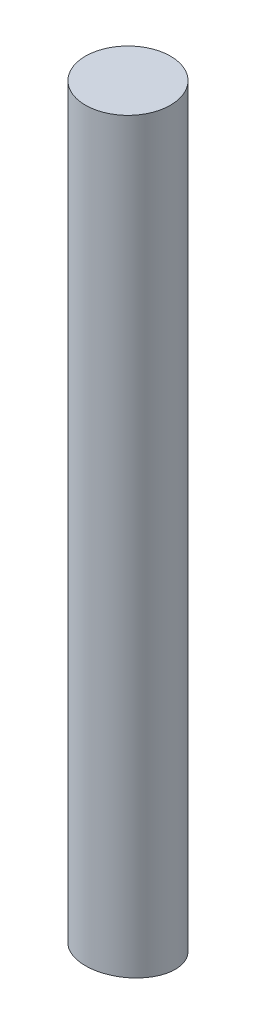
ISO-10303-21;
HEADER;
FILE_DESCRIPTION(('STEP AP214'),'2;1');
FILE_NAME('part.step','',(''),(''),'','','');
FILE_SCHEMA(('AUTOMOTIVE_DESIGN { 1 0 10303 214 1 1 1 1 }'));
ENDSEC;
DATA;
#1=APPLICATION_CONTEXT('core data for automotive mechanical design processes');
#2=APPLICATION_PROTOCOL_DEFINITION('international standard','automotive_design',2000,#1);
#3=PRODUCT_CONTEXT('',#1,'mechanical');
#4=PRODUCT('Part','Part','',(#3));
#5=PRODUCT_RELATED_PRODUCT_CATEGORY('part','',(#4));
#6=PRODUCT_DEFINITION_FORMATION('','',#4);
#7=PRODUCT_DEFINITION_CONTEXT('part definition',#1,'design');
#8=PRODUCT_DEFINITION('design','',#6,#7);
#9=PRODUCT_DEFINITION_SHAPE('','',#8);
#10=(LENGTH_UNIT() NAMED_UNIT(*) SI_UNIT(.MILLI.,.METRE.));
#11=(NAMED_UNIT(*) PLANE_ANGLE_UNIT() SI_UNIT($,.RADIAN.));
#12=(NAMED_UNIT(*) SI_UNIT($,.STERADIAN.) SOLID_ANGLE_UNIT());
#13=UNCERTAINTY_MEASURE_WITH_UNIT(LENGTH_MEASURE(1.E-05),#10,'distance_accuracy_value','');
#14=(GEOMETRIC_REPRESENTATION_CONTEXT(3) GLOBAL_UNCERTAINTY_ASSIGNED_CONTEXT((#13)) GLOBAL_UNIT_ASSIGNED_CONTEXT((#10,
#11,#12)) REPRESENTATION_CONTEXT('',''));
#15=CARTESIAN_POINT('',(0.,0.,0.));
#16=DIRECTION('',(0.,0.,1.));
#17=DIRECTION('',(1.,0.,0.));
#18=AXIS2_PLACEMENT_3D('',#15,#16,#17);
#19=CARTESIAN_POINT('',(-208.,-800.,-27.));
#20=DIRECTION('',(0.,1.,0.));
#21=DIRECTION('',(0.,0.,1.));
#22=AXIS2_PLACEMENT_3D('',#19,#20,#21);
#23=CYLINDRICAL_SURFACE('',#22,45.);
#24=CARTESIAN_POINT('',(-208.,0.,-27.));
#25=DIRECTION('',(0.,-1.,0.));
#26=DIRECTION('',(0.,0.,-1.));
#27=AXIS2_PLACEMENT_3D('',#24,#25,#26);
#28=CIRCLE('',#27,45.);
#29=CARTESIAN_POINT('',(-208.,0.,-71.9999999999999));
#30=VERTEX_POINT('',#29);
#31=EDGE_CURVE('E10',#30,#30,#28,.T.);
#32=ORIENTED_EDGE('',*,*,#31,.T.);
#33=EDGE_LOOP('',(#32));
#34=FACE_BOUND('',#33,.T.);
#35=CARTESIAN_POINT('',(-208.,-794.474694759369,-27.));
#36=DIRECTION('',(0.,-0.992546151641322,0.121869343405148));
#37=DIRECTION('',(0.,0.121869343405148,0.992546151641322));
#38=AXIS2_PLACEMENT_3D('',#35,#36,#37);
#39=ELLIPSE('',#38,45.3379421456481,45.);
#40=CARTESIAN_POINT('',(-208.,-788.949389518739,18.));
#41=VERTEX_POINT('',#40);
#42=EDGE_CURVE('E38',#41,#41,#39,.T.);
#43=ORIENTED_EDGE('',*,*,#42,.F.);
#44=EDGE_LOOP('',(#43));
#45=FACE_BOUND('',#44,.T.);
#46=ADVANCED_FACE('F32',(#34,#45),#23,.T.);
#47=CARTESIAN_POINT('',(-208.,0.,-27.));
#48=DIRECTION('',(0.,-1.,0.));
#49=DIRECTION('',(0.,0.,-1.));
#50=AXIS2_PLACEMENT_3D('',#47,#48,#49);
#51=PLANE('',#50);
#52=ORIENTED_EDGE('',*,*,#31,.F.);
#53=EDGE_LOOP('',(#52));
#54=FACE_BOUND('',#53,.T.);
#55=ADVANCED_FACE('F47',(#54),#51,.F.);
#56=CARTESIAN_POINT('',(0.,-779.40910226881,95.6994043858031));
#57=DIRECTION('',(0.,-0.992546151641322,0.121869343405148));
#58=DIRECTION('',(0.,-0.121869343405148,-0.992546151641322));
#59=AXIS2_PLACEMENT_3D('',#56,#57,#58);
#60=PLANE('',#59);
#61=ORIENTED_EDGE('',*,*,#42,.T.);
#62=EDGE_LOOP('',(#61));
#63=FACE_BOUND('',#62,.T.);
#64=ADVANCED_FACE('F44',(#63),#60,.T.);
#65=CLOSED_SHELL('',(#46,#55,#64));
#66=MANIFOLD_SOLID_BREP('B2',#65);
#67=ADVANCED_BREP_SHAPE_REPRESENTATION('',(#18,#66),#14);
#68=SHAPE_DEFINITION_REPRESENTATION(#9,#67);
ENDSEC;
END-ISO-10303-21;
